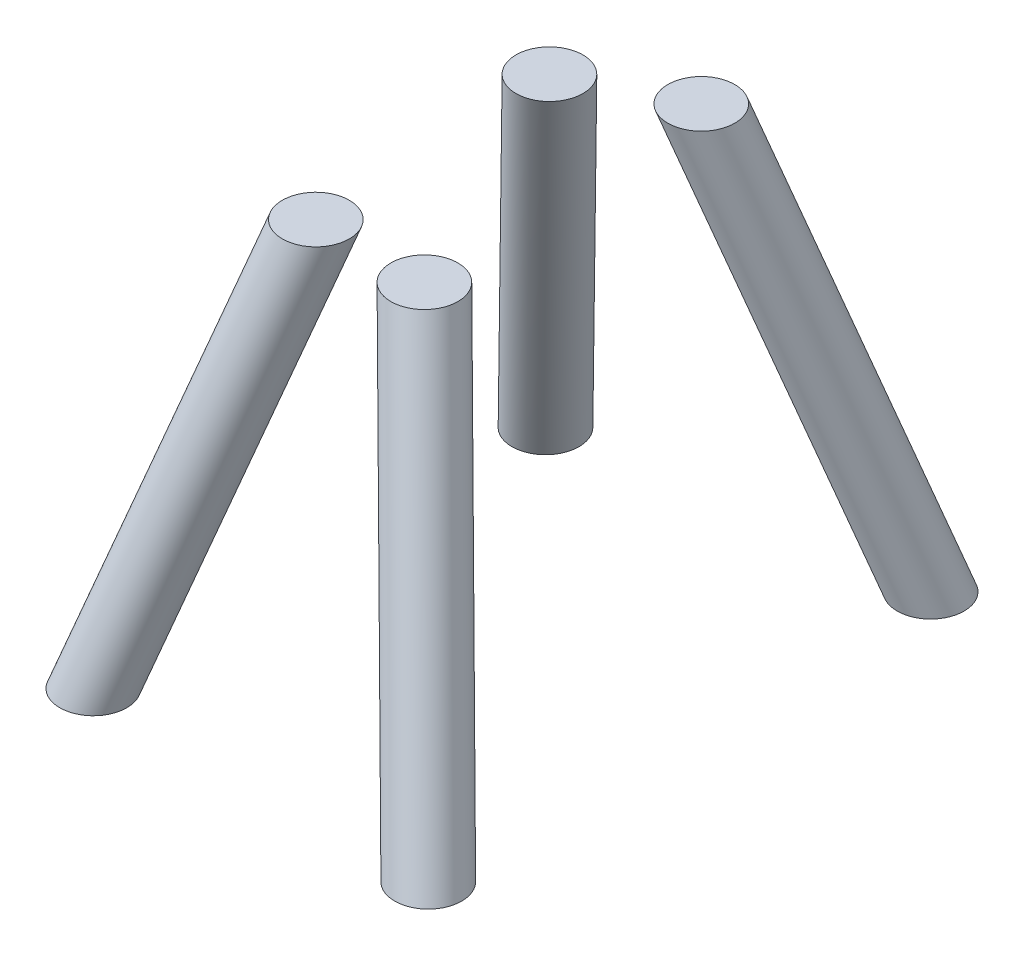
ISO-10303-21;
HEADER;
FILE_DESCRIPTION(('STEP AP214'),'2;1');
FILE_NAME('part.step','',(''),(''),'','','');
FILE_SCHEMA(('AUTOMOTIVE_DESIGN { 1 0 10303 214 1 1 1 1 }'));
ENDSEC;
DATA;
#1=APPLICATION_CONTEXT('core data for automotive mechanical design processes');
#2=APPLICATION_PROTOCOL_DEFINITION('international standard','automotive_design',2000,#1);
#3=PRODUCT_CONTEXT('',#1,'mechanical');
#4=PRODUCT('Part','Part','',(#3));
#5=PRODUCT_RELATED_PRODUCT_CATEGORY('part','',(#4));
#6=PRODUCT_DEFINITION_FORMATION('','',#4);
#7=PRODUCT_DEFINITION_CONTEXT('part definition',#1,'design');
#8=PRODUCT_DEFINITION('design','',#6,#7);
#9=PRODUCT_DEFINITION_SHAPE('','',#8);
#10=(LENGTH_UNIT() NAMED_UNIT(*) SI_UNIT(.MILLI.,.METRE.));
#11=(NAMED_UNIT(*) PLANE_ANGLE_UNIT() SI_UNIT($,.RADIAN.));
#12=(NAMED_UNIT(*) SI_UNIT($,.STERADIAN.) SOLID_ANGLE_UNIT());
#13=UNCERTAINTY_MEASURE_WITH_UNIT(LENGTH_MEASURE(1.E-05),#10,'distance_accuracy_value','');
#14=(GEOMETRIC_REPRESENTATION_CONTEXT(3) GLOBAL_UNCERTAINTY_ASSIGNED_CONTEXT((#13)) GLOBAL_UNIT_ASSIGNED_CONTEXT((#10,
#11,#12)) REPRESENTATION_CONTEXT('',''));
#15=CARTESIAN_POINT('',(0.,0.,0.));
#16=DIRECTION('',(0.,0.,1.));
#17=DIRECTION('',(1.,0.,0.));
#18=AXIS2_PLACEMENT_3D('',#15,#16,#17);
#19=CARTESIAN_POINT('',(-50.,0.,-60.));
#20=DIRECTION('',(0.,1.,0.));
#21=DIRECTION('',(0.,0.,1.));
#22=AXIS2_PLACEMENT_3D('',#19,#20,#21);
#23=PLANE('',#22);
#24=CARTESIAN_POINT('',(-50.,0.,-60.));
#25=DIRECTION('',(0.,1.,0.));
#26=DIRECTION('',(0.,0.,1.));
#27=AXIS2_PLACEMENT_3D('',#24,#25,#26);
#28=CIRCLE('',#27,10.);
#29=CARTESIAN_POINT('',(-50.,0.,-50.));
#30=VERTEX_POINT('',#29);
#31=EDGE_CURVE('E52',#30,#30,#28,.T.);
#32=ORIENTED_EDGE('',*,*,#31,.F.);
#33=EDGE_LOOP('',(#32));
#34=FACE_BOUND('',#33,.T.);
#35=ADVANCED_FACE('F45',(#34),#23,.F.);
#36=CARTESIAN_POINT('',(-15.1666049839545,125.570357417579,-26.3535241366718));
#37=DIRECTION('',(0.,1.,0.));
#38=DIRECTION('',(0.,0.,1.));
#39=AXIS2_PLACEMENT_3D('',#36,#37,#38);
#40=PLANE('',#39);
#41=CARTESIAN_POINT('',(-15.1666049839545,125.570357417579,-26.3535241366718));
#42=DIRECTION('',(0.,1.,0.));
#43=DIRECTION('',(0.,0.,1.));
#44=AXIS2_PLACEMENT_3D('',#41,#42,#43);
#45=CIRCLE('',#44,10.);
#46=CARTESIAN_POINT('',(-15.1666049839545,125.570357417579,-16.3535241366718));
#47=VERTEX_POINT('',#46);
#48=EDGE_CURVE('E12',#47,#47,#45,.T.);
#49=ORIENTED_EDGE('',*,*,#48,.T.);
#50=EDGE_LOOP('',(#49));
#51=FACE_BOUND('',#50,.T.);
#52=ADVANCED_FACE('F59',(#51),#40,.T.);
#53=CARTESIAN_POINT('',(-50.,0.,-50.));
#54=CARTESIAN_POINT('',(-15.1666049839545,125.570357417579,-16.3535241366718));
#55=CARTESIAN_POINT('',(-30.,0.,-50.));
#56=CARTESIAN_POINT('',(4.83339501604553,125.570357417579,-16.3535241366718));
#57=CARTESIAN_POINT('',(-30.,0.,-70.));
#58=CARTESIAN_POINT('',(4.83339501604553,125.570357417579,-36.3535241366718));
#59=CARTESIAN_POINT('',(-50.,0.,-70.));
#60=CARTESIAN_POINT('',(-15.1666049839545,125.570357417579,-36.3535241366718));
#61=CARTESIAN_POINT('',(-70.,0.,-70.));
#62=CARTESIAN_POINT('',(-35.1666049839545,125.570357417579,-36.3535241366718));
#63=CARTESIAN_POINT('',(-70.,0.,-50.));
#64=CARTESIAN_POINT('',(-35.1666049839545,125.570357417579,-16.3535241366718));
#65=CARTESIAN_POINT('',(-50.,0.,-50.));
#66=CARTESIAN_POINT('',(-15.1666049839545,125.570357417579,-16.3535241366718));
#67=(BOUNDED_SURFACE() B_SPLINE_SURFACE(3,1,((#53,#54),(#55,#56),(#57,#58),(#59,#60),(#61,#62),
(#63,#64),(#65,#66)),.UNSPECIFIED.,.T.,.F.,.F.) B_SPLINE_SURFACE_WITH_KNOTS((4,3,4),(2,2),(0.,
0.5,1.),(0.,1.),.UNSPECIFIED.) GEOMETRIC_REPRESENTATION_ITEM() RATIONAL_B_SPLINE_SURFACE(((1.,
1.),(0.333333333333333,0.333333333333333),(0.333333333333333,0.333333333333333),(1.,1.),
(0.333333333333333,0.333333333333333),(0.333333333333333,0.333333333333333),(1.,1.))) REPRESENTATION_ITEM('') SURFACE());
#68=ORIENTED_EDGE('',*,*,#48,.F.);
#69=EDGE_LOOP('',(#68));
#70=FACE_BOUND('',#69,.T.);
#71=ORIENTED_EDGE('',*,*,#31,.T.);
#72=EDGE_LOOP('',(#71));
#73=FACE_BOUND('',#72,.T.);
#74=ADVANCED_FACE('F61',(#70,#73),#67,.T.);
#75=CLOSED_SHELL('',(#35,#52,#74));
#76=MANIFOLD_SOLID_BREP('B2',#75);
#77=CARTESIAN_POINT('',(50.,0.,-75.));
#78=DIRECTION('',(0.,1.,0.));
#79=DIRECTION('',(0.,0.,1.));
#80=AXIS2_PLACEMENT_3D('',#77,#78,#79);
#81=PLANE('',#80);
#82=CARTESIAN_POINT('',(50.,0.,-75.));
#83=DIRECTION('',(0.,1.,0.));
#84=DIRECTION('',(0.,0.,1.));
#85=AXIS2_PLACEMENT_3D('',#82,#83,#84);
#86=CIRCLE('',#85,10.);
#87=CARTESIAN_POINT('',(50.,0.,-65.));
#88=VERTEX_POINT('',#87);
#89=EDGE_CURVE('E113',#88,#88,#86,.T.);
#90=ORIENTED_EDGE('',*,*,#89,.F.);
#91=EDGE_LOOP('',(#90));
#92=FACE_BOUND('',#91,.T.);
#93=ADVANCED_FACE('F106',(#92),#81,.F.);
#94=CARTESIAN_POINT('',(15.1666049839545,125.570357417579,-41.3535241366717));
#95=DIRECTION('',(0.,1.,0.));
#96=DIRECTION('',(0.,0.,1.));
#97=AXIS2_PLACEMENT_3D('',#94,#95,#96);
#98=PLANE('',#97);
#99=CARTESIAN_POINT('',(15.1666049839545,125.570357417579,-41.3535241366717));
#100=DIRECTION('',(0.,1.,0.));
#101=DIRECTION('',(0.,0.,1.));
#102=AXIS2_PLACEMENT_3D('',#99,#100,#101);
#103=CIRCLE('',#102,10.);
#104=CARTESIAN_POINT('',(15.1666049839545,125.570357417579,-31.3535241366717));
#105=VERTEX_POINT('',#104);
#106=EDGE_CURVE('E43',#105,#105,#103,.T.);
#107=ORIENTED_EDGE('',*,*,#106,.T.);
#108=EDGE_LOOP('',(#107));
#109=FACE_BOUND('',#108,.T.);
#110=ADVANCED_FACE('F120',(#109),#98,.T.);
#111=CARTESIAN_POINT('',(50.,0.,-65.));
#112=CARTESIAN_POINT('',(15.1666049839545,125.570357417579,-31.3535241366718));
#113=CARTESIAN_POINT('',(70.,0.,-65.));
#114=CARTESIAN_POINT('',(35.1666049839545,125.570357417579,-31.3535241366718));
#115=CARTESIAN_POINT('',(70.,0.,-85.));
#116=CARTESIAN_POINT('',(35.1666049839545,125.570357417579,-51.3535241366718));
#117=CARTESIAN_POINT('',(50.,0.,-85.));
#118=CARTESIAN_POINT('',(15.1666049839545,125.570357417579,-51.3535241366718));
#119=CARTESIAN_POINT('',(30.,0.,-85.));
#120=CARTESIAN_POINT('',(-4.83339501604551,125.570357417579,-51.3535241366718));
#121=CARTESIAN_POINT('',(30.,0.,-65.));
#122=CARTESIAN_POINT('',(-4.83339501604551,125.570357417579,-31.3535241366718));
#123=CARTESIAN_POINT('',(50.,0.,-65.));
#124=CARTESIAN_POINT('',(15.1666049839545,125.570357417579,-31.3535241366718));
#125=(BOUNDED_SURFACE() B_SPLINE_SURFACE(3,1,((#111,#112),(#113,#114),(#115,#116),(#117,#118),
(#119,#120),(#121,#122),(#123,#124)),.UNSPECIFIED.,.T.,.F.,.F.) B_SPLINE_SURFACE_WITH_KNOTS((4,
3,4),(2,2),(0.,0.5,1.),(0.,1.),
.UNSPECIFIED.) GEOMETRIC_REPRESENTATION_ITEM() RATIONAL_B_SPLINE_SURFACE(((1.,1.),
(0.333333333333333,0.333333333333333),(0.333333333333333,0.333333333333333),(1.,1.),
(0.333333333333333,0.333333333333333),(0.333333333333333,0.333333333333333),(1.,1.))) REPRESENTATION_ITEM('') SURFACE());
#126=ORIENTED_EDGE('',*,*,#106,.F.);
#127=EDGE_LOOP('',(#126));
#128=FACE_BOUND('',#127,.T.);
#129=ORIENTED_EDGE('',*,*,#89,.T.);
#130=EDGE_LOOP('',(#129));
#131=FACE_BOUND('',#130,.T.);
#132=ADVANCED_FACE('F122',(#128,#131),#125,.T.);
#133=CLOSED_SHELL('',(#93,#110,#132));
#134=MANIFOLD_SOLID_BREP('B6',#133);
#135=CARTESIAN_POINT('',(50.,0.,75.));
#136=DIRECTION('',(0.,1.,0.));
#137=DIRECTION('',(0.,0.,1.));
#138=AXIS2_PLACEMENT_3D('',#135,#136,#137);
#139=PLANE('',#138);
#140=CARTESIAN_POINT('',(50.,0.,75.));
#141=DIRECTION('',(0.,1.,0.));
#142=DIRECTION('',(0.,0.,1.));
#143=AXIS2_PLACEMENT_3D('',#140,#141,#142);
#144=CIRCLE('',#143,9.99999999999999);
#145=CARTESIAN_POINT('',(50.,0.,85.));
#146=VERTEX_POINT('',#145);
#147=EDGE_CURVE('E173',#146,#146,#144,.T.);
#148=ORIENTED_EDGE('',*,*,#147,.F.);
#149=EDGE_LOOP('',(#148));
#150=FACE_BOUND('',#149,.T.);
#151=ADVANCED_FACE('F166',(#150),#139,.F.);
#152=CARTESIAN_POINT('',(16.2068602957687,121.820357417579,42.3583336082894));
#153=DIRECTION('',(0.,1.,0.));
#154=DIRECTION('',(0.,0.,1.));
#155=AXIS2_PLACEMENT_3D('',#152,#153,#154);
#156=PLANE('',#155);
#157=CARTESIAN_POINT('',(16.2068602957687,121.820357417579,42.3583336082894));
#158=DIRECTION('',(0.,1.,0.));
#159=DIRECTION('',(0.,0.,1.));
#160=AXIS2_PLACEMENT_3D('',#157,#158,#159);
#161=CIRCLE('',#160,9.99999999999999);
#162=CARTESIAN_POINT('',(16.2068602957687,121.820357417579,52.3583336082894));
#163=VERTEX_POINT('',#162);
#164=EDGE_CURVE('E104',#163,#163,#161,.T.);
#165=ORIENTED_EDGE('',*,*,#164,.T.);
#166=EDGE_LOOP('',(#165));
#167=FACE_BOUND('',#166,.T.);
#168=ADVANCED_FACE('F180',(#167),#156,.T.);
#169=CARTESIAN_POINT('',(50.,0.,85.));
#170=CARTESIAN_POINT('',(16.2068602957687,121.820357417579,52.3583336082894));
#171=CARTESIAN_POINT('',(70.,0.,85.));
#172=CARTESIAN_POINT('',(36.2068602957687,121.820357417579,52.3583336082894));
#173=CARTESIAN_POINT('',(70.,0.,65.));
#174=CARTESIAN_POINT('',(36.2068602957687,121.820357417579,32.3583336082894));
#175=CARTESIAN_POINT('',(50.,0.,65.));
#176=CARTESIAN_POINT('',(16.2068602957687,121.820357417579,32.3583336082894));
#177=CARTESIAN_POINT('',(30.,0.,65.));
#178=CARTESIAN_POINT('',(-3.79313970423127,121.820357417579,32.3583336082894));
#179=CARTESIAN_POINT('',(30.,0.,85.));
#180=CARTESIAN_POINT('',(-3.79313970423127,121.820357417579,52.3583336082894));
#181=CARTESIAN_POINT('',(50.,0.,85.));
#182=CARTESIAN_POINT('',(16.2068602957687,121.820357417579,52.3583336082894));
#183=(BOUNDED_SURFACE() B_SPLINE_SURFACE(3,1,((#169,#170),(#171,#172),(#173,#174),(#175,#176),
(#177,#178),(#179,#180),(#181,#182)),.UNSPECIFIED.,.T.,.F.,.F.) B_SPLINE_SURFACE_WITH_KNOTS((4,
3,4),(2,2),(0.,0.5,1.),(0.,1.),
.UNSPECIFIED.) GEOMETRIC_REPRESENTATION_ITEM() RATIONAL_B_SPLINE_SURFACE(((1.,1.),
(0.333333333333333,0.333333333333333),(0.333333333333333,0.333333333333333),(1.,1.),
(0.333333333333333,0.333333333333333),(0.333333333333333,0.333333333333333),(1.,1.))) REPRESENTATION_ITEM('') SURFACE());
#184=ORIENTED_EDGE('',*,*,#164,.F.);
#185=EDGE_LOOP('',(#184));
#186=FACE_BOUND('',#185,.T.);
#187=ORIENTED_EDGE('',*,*,#147,.T.);
#188=EDGE_LOOP('',(#187));
#189=FACE_BOUND('',#188,.T.);
#190=ADVANCED_FACE('F182',(#186,#189),#183,.T.);
#191=CLOSED_SHELL('',(#151,#168,#190));
#192=MANIFOLD_SOLID_BREP('B37',#191);
#193=CARTESIAN_POINT('',(-50.,0.,75.));
#194=DIRECTION('',(0.,1.,0.));
#195=DIRECTION('',(0.,0.,1.));
#196=AXIS2_PLACEMENT_3D('',#193,#194,#195);
#197=PLANE('',#196);
#198=CARTESIAN_POINT('',(-50.,0.,75.));
#199=DIRECTION('',(0.,1.,0.));
#200=DIRECTION('',(0.,0.,1.));
#201=AXIS2_PLACEMENT_3D('',#198,#199,#200);
#202=CIRCLE('',#201,10.);
#203=CARTESIAN_POINT('',(-50.,0.,85.));
#204=VERTEX_POINT('',#203);
#205=EDGE_CURVE('E224',#204,#204,#202,.T.);
#206=ORIENTED_EDGE('',*,*,#205,.F.);
#207=EDGE_LOOP('',(#206));
#208=FACE_BOUND('',#207,.T.);
#209=ADVANCED_FACE('F217',(#208),#197,.F.);
#210=CARTESIAN_POINT('',(-16.2068602957686,121.820357417579,42.3583336082894));
#211=DIRECTION('',(0.,1.,0.));
#212=DIRECTION('',(0.,0.,1.));
#213=AXIS2_PLACEMENT_3D('',#210,#211,#212);
#214=PLANE('',#213);
#215=CARTESIAN_POINT('',(-16.2068602957686,121.820357417579,42.3583336082894));
#216=DIRECTION('',(0.,1.,0.));
#217=DIRECTION('',(0.,0.,1.));
#218=AXIS2_PLACEMENT_3D('',#215,#216,#217);
#219=CIRCLE('',#218,10.);
#220=CARTESIAN_POINT('',(-16.2068602957686,121.820357417579,52.3583336082894));
#221=VERTEX_POINT('',#220);
#222=EDGE_CURVE('E164',#221,#221,#219,.T.);
#223=ORIENTED_EDGE('',*,*,#222,.T.);
#224=EDGE_LOOP('',(#223));
#225=FACE_BOUND('',#224,.T.);
#226=ADVANCED_FACE('F231',(#225),#214,.T.);
#227=CARTESIAN_POINT('',(-50.,0.,85.));
#228=CARTESIAN_POINT('',(-16.2068602957686,121.820357417579,52.3583336082894));
#229=CARTESIAN_POINT('',(-30.,0.,85.));
#230=CARTESIAN_POINT('',(3.79313970423138,121.820357417579,52.3583336082894));
#231=CARTESIAN_POINT('',(-30.,0.,65.));
#232=CARTESIAN_POINT('',(3.79313970423138,121.820357417579,32.3583336082893));
#233=CARTESIAN_POINT('',(-50.,0.,65.));
#234=CARTESIAN_POINT('',(-16.2068602957686,121.820357417579,32.3583336082894));
#235=CARTESIAN_POINT('',(-70.,0.,65.));
#236=CARTESIAN_POINT('',(-36.2068602957687,121.820357417579,32.3583336082893));
#237=CARTESIAN_POINT('',(-70.,0.,85.));
#238=CARTESIAN_POINT('',(-36.2068602957687,121.820357417579,52.3583336082894));
#239=CARTESIAN_POINT('',(-50.,0.,85.));
#240=CARTESIAN_POINT('',(-16.2068602957686,121.820357417579,52.3583336082894));
#241=(BOUNDED_SURFACE() B_SPLINE_SURFACE(3,1,((#227,#228),(#229,#230),(#231,#232),(#233,#234),
(#235,#236),(#237,#238),(#239,#240)),.UNSPECIFIED.,.T.,.F.,.F.) B_SPLINE_SURFACE_WITH_KNOTS((4,
3,4),(2,2),(0.,0.5,1.),(0.,1.),
.UNSPECIFIED.) GEOMETRIC_REPRESENTATION_ITEM() RATIONAL_B_SPLINE_SURFACE(((1.,1.),
(0.333333333333333,0.333333333333333),(0.333333333333333,0.333333333333333),(1.,1.),
(0.333333333333333,0.333333333333333),(0.333333333333333,0.333333333333333),(1.,1.))) REPRESENTATION_ITEM('') SURFACE());
#242=ORIENTED_EDGE('',*,*,#222,.F.);
#243=EDGE_LOOP('',(#242));
#244=FACE_BOUND('',#243,.T.);
#245=ORIENTED_EDGE('',*,*,#205,.T.);
#246=EDGE_LOOP('',(#245));
#247=FACE_BOUND('',#246,.T.);
#248=ADVANCED_FACE('F233',(#244,#247),#241,.T.);
#249=CLOSED_SHELL('',(#209,#226,#248));
#250=MANIFOLD_SOLID_BREP('B98',#249);
#251=ADVANCED_BREP_SHAPE_REPRESENTATION('',(#18,#76,#134,#192,#250),#14);
#252=SHAPE_DEFINITION_REPRESENTATION(#9,#251);
ENDSEC;
END-ISO-10303-21;
